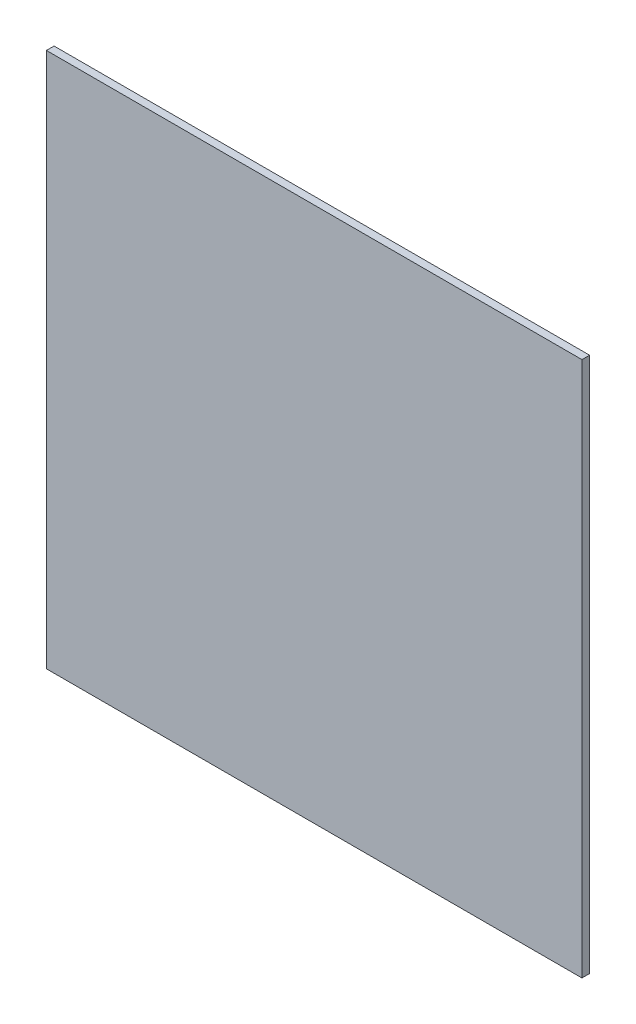
ISO-10303-21;
HEADER;
FILE_DESCRIPTION(('STEP AP214'),'2;1');
FILE_NAME('part.step','',(''),(''),'','','');
FILE_SCHEMA(('AUTOMOTIVE_DESIGN { 1 0 10303 214 1 1 1 1 }'));
ENDSEC;
DATA;
#1=APPLICATION_CONTEXT('core data for automotive mechanical design processes');
#2=APPLICATION_PROTOCOL_DEFINITION('international standard','automotive_design',2000,#1);
#3=PRODUCT_CONTEXT('',#1,'mechanical');
#4=PRODUCT('Part','Part','',(#3));
#5=PRODUCT_RELATED_PRODUCT_CATEGORY('part','',(#4));
#6=PRODUCT_DEFINITION_FORMATION('','',#4);
#7=PRODUCT_DEFINITION_CONTEXT('part definition',#1,'design');
#8=PRODUCT_DEFINITION('design','',#6,#7);
#9=PRODUCT_DEFINITION_SHAPE('','',#8);
#10=(LENGTH_UNIT() NAMED_UNIT(*) SI_UNIT(.MILLI.,.METRE.));
#11=(NAMED_UNIT(*) PLANE_ANGLE_UNIT() SI_UNIT($,.RADIAN.));
#12=(NAMED_UNIT(*) SI_UNIT($,.STERADIAN.) SOLID_ANGLE_UNIT());
#13=UNCERTAINTY_MEASURE_WITH_UNIT(LENGTH_MEASURE(1.E-05),#10,'distance_accuracy_value','');
#14=(GEOMETRIC_REPRESENTATION_CONTEXT(3) GLOBAL_UNCERTAINTY_ASSIGNED_CONTEXT((#13)) GLOBAL_UNIT_ASSIGNED_CONTEXT((#10,
#11,#12)) REPRESENTATION_CONTEXT('',''));
#15=CARTESIAN_POINT('',(0.,0.,0.));
#16=DIRECTION('',(0.,0.,1.));
#17=DIRECTION('',(1.,0.,0.));
#18=AXIS2_PLACEMENT_3D('',#15,#16,#17);
#19=CARTESIAN_POINT('',(-49.8973103010784,30.8410510906163,10.));
#20=DIRECTION('',(1.,0.,0.));
#21=DIRECTION('',(0.,0.,-1.));
#22=AXIS2_PLACEMENT_3D('',#19,#20,#21);
#23=PLANE('',#22);
#24=DIRECTION('',(0.,-1.,0.));
#25=VECTOR('',#24,1.);
#26=CARTESIAN_POINT('',(-49.8973103010784,30.8410510906163,0.));
#27=LINE('',#26,#25);
#28=CARTESIAN_POINT('',(-49.8973103010784,30.8410510906163,0.));
#29=VERTEX_POINT('',#28);
#30=CARTESIAN_POINT('',(-49.8973103010784,-669.158948909384,0.));
#31=VERTEX_POINT('',#30);
#32=EDGE_CURVE('E98',#29,#31,#27,.T.);
#33=ORIENTED_EDGE('',*,*,#32,.T.);
#34=DIRECTION('',(0.,0.,-1.));
#35=VECTOR('',#34,1.);
#36=CARTESIAN_POINT('',(-49.8973103010784,-669.158948909384,10.));
#37=LINE('',#36,#35);
#38=CARTESIAN_POINT('',(-49.8973103010784,-669.158948909384,10.));
#39=VERTEX_POINT('',#38);
#40=EDGE_CURVE('E11',#39,#31,#37,.T.);
#41=ORIENTED_EDGE('',*,*,#40,.F.);
#42=DIRECTION('',(0.,-1.,0.));
#43=VECTOR('',#42,1.);
#44=CARTESIAN_POINT('',(-49.8973103010784,30.8410510906163,10.));
#45=LINE('',#44,#43);
#46=CARTESIAN_POINT('',(-49.8973103010784,30.8410510906163,10.));
#47=VERTEX_POINT('',#46);
#48=EDGE_CURVE('E86',#47,#39,#45,.T.);
#49=ORIENTED_EDGE('',*,*,#48,.F.);
#50=DIRECTION('',(0.,0.,-1.));
#51=VECTOR('',#50,1.);
#52=CARTESIAN_POINT('',(-49.8973103010784,30.8410510906163,10.));
#53=LINE('',#52,#51);
#54=EDGE_CURVE('E94',#47,#29,#53,.T.);
#55=ORIENTED_EDGE('',*,*,#54,.T.);
#56=EDGE_LOOP('',(#33,#41,#49,#55));
#57=FACE_BOUND('',#56,.T.);
#58=ADVANCED_FACE('F35',(#57),#23,.F.);
#59=CARTESIAN_POINT('',(-49.8973103010784,-669.158948909384,10.));
#60=DIRECTION('',(0.,1.,0.));
#61=DIRECTION('',(0.,0.,1.));
#62=AXIS2_PLACEMENT_3D('',#59,#60,#61);
#63=PLANE('',#62);
#64=DIRECTION('',(1.,0.,0.));
#65=VECTOR('',#64,1.);
#66=CARTESIAN_POINT('',(-49.8973103010784,-669.158948909384,0.));
#67=LINE('',#66,#65);
#68=CARTESIAN_POINT('',(650.102689698921,-669.158948909384,0.));
#69=VERTEX_POINT('',#68);
#70=EDGE_CURVE('E90',#31,#69,#67,.T.);
#71=ORIENTED_EDGE('',*,*,#70,.T.);
#72=DIRECTION('',(0.,0.,-1.));
#73=VECTOR('',#72,1.);
#74=CARTESIAN_POINT('',(650.102689698921,-669.158948909384,10.));
#75=LINE('',#74,#73);
#76=CARTESIAN_POINT('',(650.102689698921,-669.158948909384,10.));
#77=VERTEX_POINT('',#76);
#78=EDGE_CURVE('E43',#77,#69,#75,.T.);
#79=ORIENTED_EDGE('',*,*,#78,.F.);
#80=DIRECTION('',(1.,0.,0.));
#81=VECTOR('',#80,1.);
#82=CARTESIAN_POINT('',(-49.8973103010784,-669.158948909384,10.));
#83=LINE('',#82,#81);
#84=EDGE_CURVE('E81',#39,#77,#83,.T.);
#85=ORIENTED_EDGE('',*,*,#84,.F.);
#86=ORIENTED_EDGE('',*,*,#40,.T.);
#87=EDGE_LOOP('',(#71,#79,#85,#86));
#88=FACE_BOUND('',#87,.T.);
#89=ADVANCED_FACE('F89',(#88),#63,.F.);
#90=CARTESIAN_POINT('',(650.102689698921,30.8410510906163,10.));
#91=DIRECTION('',(-1.,0.,0.));
#92=DIRECTION('',(0.,0.,1.));
#93=AXIS2_PLACEMENT_3D('',#90,#91,#92);
#94=PLANE('',#93);
#95=DIRECTION('',(0.,1.,0.));
#96=VECTOR('',#95,1.);
#97=CARTESIAN_POINT('',(650.102689698921,30.8410510906163,0.));
#98=LINE('',#97,#96);
#99=CARTESIAN_POINT('',(650.102689698921,30.8410510906163,0.));
#100=VERTEX_POINT('',#99);
#101=EDGE_CURVE('E68',#69,#100,#98,.T.);
#102=ORIENTED_EDGE('',*,*,#101,.T.);
#103=DIRECTION('',(0.,0.,-1.));
#104=VECTOR('',#103,1.);
#105=CARTESIAN_POINT('',(650.102689698921,30.8410510906163,10.));
#106=LINE('',#105,#104);
#107=CARTESIAN_POINT('',(650.102689698921,30.8410510906163,10.));
#108=VERTEX_POINT('',#107);
#109=EDGE_CURVE('E91',#108,#100,#106,.T.);
#110=ORIENTED_EDGE('',*,*,#109,.F.);
#111=DIRECTION('',(0.,1.,0.));
#112=VECTOR('',#111,1.);
#113=CARTESIAN_POINT('',(650.102689698921,30.8410510906163,10.));
#114=LINE('',#113,#112);
#115=EDGE_CURVE('E84',#77,#108,#114,.T.);
#116=ORIENTED_EDGE('',*,*,#115,.F.);
#117=ORIENTED_EDGE('',*,*,#78,.T.);
#118=EDGE_LOOP('',(#102,#110,#116,#117));
#119=FACE_BOUND('',#118,.T.);
#120=ADVANCED_FACE('F92',(#119),#94,.F.);
#121=CARTESIAN_POINT('',(-49.8973103010784,30.8410510906163,10.));
#122=DIRECTION('',(0.,-1.,0.));
#123=DIRECTION('',(0.,0.,-1.));
#124=AXIS2_PLACEMENT_3D('',#121,#122,#123);
#125=PLANE('',#124);
#126=DIRECTION('',(-1.,0.,0.));
#127=VECTOR('',#126,1.);
#128=CARTESIAN_POINT('',(-49.8973103010784,30.8410510906163,0.));
#129=LINE('',#128,#127);
#130=EDGE_CURVE('E74',#100,#29,#129,.T.);
#131=ORIENTED_EDGE('',*,*,#130,.T.);
#132=ORIENTED_EDGE('',*,*,#54,.F.);
#133=DIRECTION('',(-1.,0.,0.));
#134=VECTOR('',#133,1.);
#135=CARTESIAN_POINT('',(-49.8973103010784,30.8410510906163,10.));
#136=LINE('',#135,#134);
#137=EDGE_CURVE('E51',#108,#47,#136,.T.);
#138=ORIENTED_EDGE('',*,*,#137,.F.);
#139=ORIENTED_EDGE('',*,*,#109,.T.);
#140=EDGE_LOOP('',(#131,#132,#138,#139));
#141=FACE_BOUND('',#140,.T.);
#142=ADVANCED_FACE('F105',(#141),#125,.F.);
#143=CARTESIAN_POINT('',(0.,0.,10.));
#144=DIRECTION('',(0.,0.,1.));
#145=DIRECTION('',(1.,0.,0.));
#146=AXIS2_PLACEMENT_3D('',#143,#144,#145);
#147=PLANE('',#146);
#148=ORIENTED_EDGE('',*,*,#48,.T.);
#149=ORIENTED_EDGE('',*,*,#84,.T.);
#150=ORIENTED_EDGE('',*,*,#115,.T.);
#151=ORIENTED_EDGE('',*,*,#137,.T.);
#152=EDGE_LOOP('',(#148,#149,#150,#151));
#153=FACE_BOUND('',#152,.T.);
#154=ADVANCED_FACE('F82',(#153),#147,.T.);
#155=CARTESIAN_POINT('',(0.,0.,0.));
#156=DIRECTION('',(0.,0.,1.));
#157=DIRECTION('',(1.,0.,0.));
#158=AXIS2_PLACEMENT_3D('',#155,#156,#157);
#159=PLANE('',#158);
#160=ORIENTED_EDGE('',*,*,#32,.F.);
#161=ORIENTED_EDGE('',*,*,#130,.F.);
#162=ORIENTED_EDGE('',*,*,#101,.F.);
#163=ORIENTED_EDGE('',*,*,#70,.F.);
#164=EDGE_LOOP('',(#160,#161,#162,#163));
#165=FACE_BOUND('',#164,.T.);
#166=ADVANCED_FACE('F108',(#165),#159,.F.);
#167=CLOSED_SHELL('',(#58,#89,#120,#142,#154,#166));
#168=MANIFOLD_SOLID_BREP('B2',#167);
#169=ADVANCED_BREP_SHAPE_REPRESENTATION('',(#18,#168),#14);
#170=SHAPE_DEFINITION_REPRESENTATION(#9,#169);
ENDSEC;
END-ISO-10303-21;
